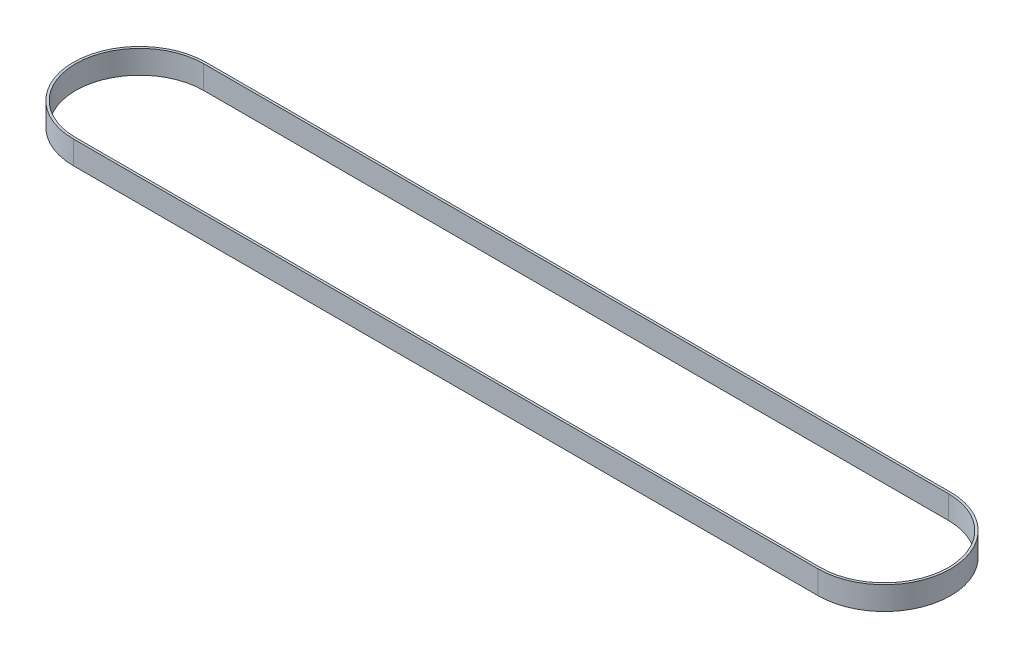
ISO-10303-21;
HEADER;
FILE_DESCRIPTION(('STEP AP214'),'2;1');
FILE_NAME('part.step','',(''),(''),'','','');
FILE_SCHEMA(('AUTOMOTIVE_DESIGN { 1 0 10303 214 1 1 1 1 }'));
ENDSEC;
DATA;
#1=APPLICATION_CONTEXT('core data for automotive mechanical design processes');
#2=APPLICATION_PROTOCOL_DEFINITION('international standard','automotive_design',2000,#1);
#3=PRODUCT_CONTEXT('',#1,'mechanical');
#4=PRODUCT('Part','Part','',(#3));
#5=PRODUCT_RELATED_PRODUCT_CATEGORY('part','',(#4));
#6=PRODUCT_DEFINITION_FORMATION('','',#4);
#7=PRODUCT_DEFINITION_CONTEXT('part definition',#1,'design');
#8=PRODUCT_DEFINITION('design','',#6,#7);
#9=PRODUCT_DEFINITION_SHAPE('','',#8);
#10=(LENGTH_UNIT() NAMED_UNIT(*) SI_UNIT(.MILLI.,.METRE.));
#11=(NAMED_UNIT(*) PLANE_ANGLE_UNIT() SI_UNIT($,.RADIAN.));
#12=(NAMED_UNIT(*) SI_UNIT($,.STERADIAN.) SOLID_ANGLE_UNIT());
#13=UNCERTAINTY_MEASURE_WITH_UNIT(LENGTH_MEASURE(1.E-05),#10,'distance_accuracy_value','');
#14=(GEOMETRIC_REPRESENTATION_CONTEXT(3) GLOBAL_UNCERTAINTY_ASSIGNED_CONTEXT((#13)) GLOBAL_UNIT_ASSIGNED_CONTEXT((#10,
#11,#12)) REPRESENTATION_CONTEXT('',''));
#15=CARTESIAN_POINT('',(0.,0.,0.));
#16=DIRECTION('',(0.,0.,1.));
#17=DIRECTION('',(1.,0.,0.));
#18=AXIS2_PLACEMENT_3D('',#15,#16,#17);
#19=CARTESIAN_POINT('',(0.,10.,0.));
#20=DIRECTION('',(0.,1.,0.));
#21=DIRECTION('',(0.,0.,1.));
#22=AXIS2_PLACEMENT_3D('',#19,#20,#21);
#23=PLANE('',#22);
#24=CARTESIAN_POINT('',(0.,10.,0.));
#25=DIRECTION('',(0.,1.,0.));
#26=DIRECTION('',(0.,0.,1.));
#27=AXIS2_PLACEMENT_3D('',#24,#25,#26);
#28=CIRCLE('',#27,28.5);
#29=CARTESIAN_POINT('',(0.,10.,-28.5));
#30=VERTEX_POINT('',#29);
#31=CARTESIAN_POINT('',(0.,10.,28.5));
#32=VERTEX_POINT('',#31);
#33=EDGE_CURVE('E153',#30,#32,#28,.T.);
#34=ORIENTED_EDGE('',*,*,#33,.T.);
#35=DIRECTION('',(1.,0.,0.));
#36=VECTOR('',#35,1.);
#37=CARTESIAN_POINT('',(0.,10.,28.5));
#38=LINE('',#37,#36);
#39=CARTESIAN_POINT('',(320.,10.,28.5));
#40=VERTEX_POINT('',#39);
#41=EDGE_CURVE('E157',#32,#40,#38,.T.);
#42=ORIENTED_EDGE('',*,*,#41,.T.);
#43=CARTESIAN_POINT('',(320.,10.,0.));
#44=DIRECTION('',(0.,1.,0.));
#45=DIRECTION('',(0.,0.,1.));
#46=AXIS2_PLACEMENT_3D('',#43,#44,#45);
#47=CIRCLE('',#46,28.5);
#48=CARTESIAN_POINT('',(320.,10.,-28.5));
#49=VERTEX_POINT('',#48);
#50=EDGE_CURVE('E161',#40,#49,#47,.T.);
#51=ORIENTED_EDGE('',*,*,#50,.T.);
#52=DIRECTION('',(-1.,0.,0.));
#53=VECTOR('',#52,1.);
#54=CARTESIAN_POINT('',(0.,10.,-28.5));
#55=LINE('',#54,#53);
#56=EDGE_CURVE('E164',#49,#30,#55,.T.);
#57=ORIENTED_EDGE('',*,*,#56,.T.);
#58=EDGE_LOOP('',(#34,#42,#51,#57));
#59=FACE_BOUND('',#58,.T.);
#60=DIRECTION('',(1.,0.,0.));
#61=VECTOR('',#60,1.);
#62=CARTESIAN_POINT('',(0.,10.,27.5));
#63=LINE('',#62,#61);
#64=CARTESIAN_POINT('',(0.,10.,27.5));
#65=VERTEX_POINT('',#64);
#66=CARTESIAN_POINT('',(320.,10.,27.5));
#67=VERTEX_POINT('',#66);
#68=EDGE_CURVE('E114',#65,#67,#63,.T.);
#69=ORIENTED_EDGE('',*,*,#68,.F.);
#70=CARTESIAN_POINT('',(0.,10.,0.));
#71=DIRECTION('',(0.,1.,0.));
#72=DIRECTION('',(0.,0.,1.));
#73=AXIS2_PLACEMENT_3D('',#70,#71,#72);
#74=CIRCLE('',#73,27.5);
#75=CARTESIAN_POINT('',(0.,10.,-27.5));
#76=VERTEX_POINT('',#75);
#77=EDGE_CURVE('E105',#76,#65,#74,.T.);
#78=ORIENTED_EDGE('',*,*,#77,.F.);
#79=DIRECTION('',(-1.,0.,0.));
#80=VECTOR('',#79,1.);
#81=CARTESIAN_POINT('',(0.,10.,-27.5));
#82=LINE('',#81,#80);
#83=CARTESIAN_POINT('',(320.,10.,-27.5));
#84=VERTEX_POINT('',#83);
#85=EDGE_CURVE('E131',#84,#76,#82,.T.);
#86=ORIENTED_EDGE('',*,*,#85,.F.);
#87=CARTESIAN_POINT('',(320.,10.,0.));
#88=DIRECTION('',(0.,1.,0.));
#89=DIRECTION('',(0.,0.,1.));
#90=AXIS2_PLACEMENT_3D('',#87,#88,#89);
#91=CIRCLE('',#90,27.5);
#92=EDGE_CURVE('E127',#67,#84,#91,.T.);
#93=ORIENTED_EDGE('',*,*,#92,.F.);
#94=EDGE_LOOP('',(#69,#78,#86,#93));
#95=FACE_BOUND('',#94,.T.);
#96=ADVANCED_FACE('F39',(#59,#95),#23,.T.);
#97=CARTESIAN_POINT('',(0.,0.,0.));
#98=DIRECTION('',(0.,1.,0.));
#99=DIRECTION('',(0.,0.,1.));
#100=AXIS2_PLACEMENT_3D('',#97,#98,#99);
#101=PLANE('',#100);
#102=CARTESIAN_POINT('',(0.,0.,0.));
#103=DIRECTION('',(0.,1.,0.));
#104=DIRECTION('',(0.,0.,1.));
#105=AXIS2_PLACEMENT_3D('',#102,#103,#104);
#106=CIRCLE('',#105,28.5);
#107=CARTESIAN_POINT('',(0.,0.,-28.5));
#108=VERTEX_POINT('',#107);
#109=CARTESIAN_POINT('',(0.,0.,28.5));
#110=VERTEX_POINT('',#109);
#111=EDGE_CURVE('E123',#108,#110,#106,.T.);
#112=ORIENTED_EDGE('',*,*,#111,.F.);
#113=DIRECTION('',(-1.,0.,0.));
#114=VECTOR('',#113,1.);
#115=CARTESIAN_POINT('',(0.,0.,-28.5));
#116=LINE('',#115,#114);
#117=CARTESIAN_POINT('',(320.,0.,-28.5));
#118=VERTEX_POINT('',#117);
#119=EDGE_CURVE('E158',#118,#108,#116,.T.);
#120=ORIENTED_EDGE('',*,*,#119,.F.);
#121=CARTESIAN_POINT('',(320.,0.,0.));
#122=DIRECTION('',(0.,1.,0.));
#123=DIRECTION('',(0.,0.,1.));
#124=AXIS2_PLACEMENT_3D('',#121,#122,#123);
#125=CIRCLE('',#124,28.5);
#126=CARTESIAN_POINT('',(320.,0.,28.5));
#127=VERTEX_POINT('',#126);
#128=EDGE_CURVE('E174',#127,#118,#125,.T.);
#129=ORIENTED_EDGE('',*,*,#128,.F.);
#130=DIRECTION('',(1.,0.,0.));
#131=VECTOR('',#130,1.);
#132=CARTESIAN_POINT('',(0.,0.,28.5));
#133=LINE('',#132,#131);
#134=EDGE_CURVE('E171',#110,#127,#133,.T.);
#135=ORIENTED_EDGE('',*,*,#134,.F.);
#136=EDGE_LOOP('',(#112,#120,#129,#135));
#137=FACE_BOUND('',#136,.T.);
#138=CARTESIAN_POINT('',(0.,0.,0.));
#139=DIRECTION('',(0.,1.,0.));
#140=DIRECTION('',(0.,0.,1.));
#141=AXIS2_PLACEMENT_3D('',#138,#139,#140);
#142=CIRCLE('',#141,27.5);
#143=CARTESIAN_POINT('',(0.,0.,-27.5));
#144=VERTEX_POINT('',#143);
#145=CARTESIAN_POINT('',(0.,0.,27.5));
#146=VERTEX_POINT('',#145);
#147=EDGE_CURVE('E63',#144,#146,#142,.T.);
#148=ORIENTED_EDGE('',*,*,#147,.T.);
#149=DIRECTION('',(1.,0.,0.));
#150=VECTOR('',#149,1.);
#151=CARTESIAN_POINT('',(0.,0.,27.5));
#152=LINE('',#151,#150);
#153=CARTESIAN_POINT('',(320.,0.,27.5));
#154=VERTEX_POINT('',#153);
#155=EDGE_CURVE('E121',#146,#154,#152,.T.);
#156=ORIENTED_EDGE('',*,*,#155,.T.);
#157=CARTESIAN_POINT('',(320.,0.,0.));
#158=DIRECTION('',(0.,1.,0.));
#159=DIRECTION('',(0.,0.,1.));
#160=AXIS2_PLACEMENT_3D('',#157,#158,#159);
#161=CIRCLE('',#160,27.5);
#162=CARTESIAN_POINT('',(320.,0.,-27.5));
#163=VERTEX_POINT('',#162);
#164=EDGE_CURVE('E140',#154,#163,#161,.T.);
#165=ORIENTED_EDGE('',*,*,#164,.T.);
#166=DIRECTION('',(-1.,0.,0.));
#167=VECTOR('',#166,1.);
#168=CARTESIAN_POINT('',(0.,0.,-27.5));
#169=LINE('',#168,#167);
#170=EDGE_CURVE('E115',#163,#144,#169,.T.);
#171=ORIENTED_EDGE('',*,*,#170,.T.);
#172=EDGE_LOOP('',(#148,#156,#165,#171));
#173=FACE_BOUND('',#172,.T.);
#174=ADVANCED_FACE('F197',(#137,#173),#101,.F.);
#175=CARTESIAN_POINT('',(0.,10.,0.));
#176=DIRECTION('',(0.,-1.,0.));
#177=DIRECTION('',(0.,0.,-1.));
#178=AXIS2_PLACEMENT_3D('',#175,#176,#177);
#179=CYLINDRICAL_SURFACE('',#178,28.5);
#180=ORIENTED_EDGE('',*,*,#111,.T.);
#181=DIRECTION('',(0.,-1.,0.));
#182=VECTOR('',#181,1.);
#183=CARTESIAN_POINT('',(0.,10.,28.5));
#184=LINE('',#183,#182);
#185=EDGE_CURVE('E11',#32,#110,#184,.T.);
#186=ORIENTED_EDGE('',*,*,#185,.F.);
#187=ORIENTED_EDGE('',*,*,#33,.F.);
#188=DIRECTION('',(0.,-1.,0.));
#189=VECTOR('',#188,1.);
#190=CARTESIAN_POINT('',(0.,10.,-28.5));
#191=LINE('',#190,#189);
#192=EDGE_CURVE('E167',#30,#108,#191,.T.);
#193=ORIENTED_EDGE('',*,*,#192,.T.);
#194=EDGE_LOOP('',(#180,#186,#187,#193));
#195=FACE_BOUND('',#194,.T.);
#196=ADVANCED_FACE('F41',(#195),#179,.T.);
#197=CARTESIAN_POINT('',(0.,10.,28.5));
#198=DIRECTION('',(0.,0.,-1.));
#199=DIRECTION('',(-1.,0.,0.));
#200=AXIS2_PLACEMENT_3D('',#197,#198,#199);
#201=PLANE('',#200);
#202=ORIENTED_EDGE('',*,*,#134,.T.);
#203=DIRECTION('',(0.,-1.,0.));
#204=VECTOR('',#203,1.);
#205=CARTESIAN_POINT('',(320.,10.,28.5));
#206=LINE('',#205,#204);
#207=EDGE_CURVE('E48',#40,#127,#206,.T.);
#208=ORIENTED_EDGE('',*,*,#207,.F.);
#209=ORIENTED_EDGE('',*,*,#41,.F.);
#210=ORIENTED_EDGE('',*,*,#185,.T.);
#211=EDGE_LOOP('',(#202,#208,#209,#210));
#212=FACE_BOUND('',#211,.T.);
#213=ADVANCED_FACE('F207',(#212),#201,.F.);
#214=CARTESIAN_POINT('',(320.,10.,0.));
#215=DIRECTION('',(0.,-1.,0.));
#216=DIRECTION('',(0.,0.,-1.));
#217=AXIS2_PLACEMENT_3D('',#214,#215,#216);
#218=CYLINDRICAL_SURFACE('',#217,28.5);
#219=ORIENTED_EDGE('',*,*,#128,.T.);
#220=DIRECTION('',(0.,-1.,0.));
#221=VECTOR('',#220,1.);
#222=CARTESIAN_POINT('',(320.,10.,-28.5));
#223=LINE('',#222,#221);
#224=EDGE_CURVE('E182',#49,#118,#223,.T.);
#225=ORIENTED_EDGE('',*,*,#224,.F.);
#226=ORIENTED_EDGE('',*,*,#50,.F.);
#227=ORIENTED_EDGE('',*,*,#207,.T.);
#228=EDGE_LOOP('',(#219,#225,#226,#227));
#229=FACE_BOUND('',#228,.T.);
#230=ADVANCED_FACE('F191',(#229),#218,.T.);
#231=CARTESIAN_POINT('',(0.,10.,-28.5));
#232=DIRECTION('',(0.,0.,1.));
#233=DIRECTION('',(1.,0.,0.));
#234=AXIS2_PLACEMENT_3D('',#231,#232,#233);
#235=PLANE('',#234);
#236=ORIENTED_EDGE('',*,*,#119,.T.);
#237=ORIENTED_EDGE('',*,*,#192,.F.);
#238=ORIENTED_EDGE('',*,*,#56,.F.);
#239=ORIENTED_EDGE('',*,*,#224,.T.);
#240=EDGE_LOOP('',(#236,#237,#238,#239));
#241=FACE_BOUND('',#240,.T.);
#242=ADVANCED_FACE('F201',(#241),#235,.F.);
#243=CARTESIAN_POINT('',(0.,10.,0.));
#244=DIRECTION('',(0.,-1.,0.));
#245=DIRECTION('',(0.,0.,-1.));
#246=AXIS2_PLACEMENT_3D('',#243,#244,#245);
#247=CYLINDRICAL_SURFACE('',#246,27.5);
#248=ORIENTED_EDGE('',*,*,#147,.F.);
#249=DIRECTION('',(0.,-1.,0.));
#250=VECTOR('',#249,1.);
#251=CARTESIAN_POINT('',(0.,10.,-27.5));
#252=LINE('',#251,#250);
#253=EDGE_CURVE('E109',#76,#144,#252,.T.);
#254=ORIENTED_EDGE('',*,*,#253,.F.);
#255=ORIENTED_EDGE('',*,*,#77,.T.);
#256=DIRECTION('',(0.,-1.,0.));
#257=VECTOR('',#256,1.);
#258=CARTESIAN_POINT('',(0.,10.,27.5));
#259=LINE('',#258,#257);
#260=EDGE_CURVE('E108',#65,#146,#259,.T.);
#261=ORIENTED_EDGE('',*,*,#260,.T.);
#262=EDGE_LOOP('',(#248,#254,#255,#261));
#263=FACE_BOUND('',#262,.T.);
#264=ADVANCED_FACE('F107',(#263),#247,.F.);
#265=CARTESIAN_POINT('',(0.,10.,27.5));
#266=DIRECTION('',(0.,0.,-1.));
#267=DIRECTION('',(-1.,0.,0.));
#268=AXIS2_PLACEMENT_3D('',#265,#266,#267);
#269=PLANE('',#268);
#270=ORIENTED_EDGE('',*,*,#155,.F.);
#271=ORIENTED_EDGE('',*,*,#260,.F.);
#272=ORIENTED_EDGE('',*,*,#68,.T.);
#273=DIRECTION('',(0.,-1.,0.));
#274=VECTOR('',#273,1.);
#275=CARTESIAN_POINT('',(320.,10.,27.5));
#276=LINE('',#275,#274);
#277=EDGE_CURVE('E124',#67,#154,#276,.T.);
#278=ORIENTED_EDGE('',*,*,#277,.T.);
#279=EDGE_LOOP('',(#270,#271,#272,#278));
#280=FACE_BOUND('',#279,.T.);
#281=ADVANCED_FACE('F118',(#280),#269,.T.);
#282=CARTESIAN_POINT('',(320.,10.,0.));
#283=DIRECTION('',(0.,-1.,0.));
#284=DIRECTION('',(0.,0.,-1.));
#285=AXIS2_PLACEMENT_3D('',#282,#283,#284);
#286=CYLINDRICAL_SURFACE('',#285,27.5);
#287=ORIENTED_EDGE('',*,*,#164,.F.);
#288=ORIENTED_EDGE('',*,*,#277,.F.);
#289=ORIENTED_EDGE('',*,*,#92,.T.);
#290=DIRECTION('',(0.,-1.,0.));
#291=VECTOR('',#290,1.);
#292=CARTESIAN_POINT('',(320.,10.,-27.5));
#293=LINE('',#292,#291);
#294=EDGE_CURVE('E55',#84,#163,#293,.T.);
#295=ORIENTED_EDGE('',*,*,#294,.T.);
#296=EDGE_LOOP('',(#287,#288,#289,#295));
#297=FACE_BOUND('',#296,.T.);
#298=ADVANCED_FACE('F230',(#297),#286,.F.);
#299=CARTESIAN_POINT('',(0.,10.,-27.5));
#300=DIRECTION('',(0.,0.,1.));
#301=DIRECTION('',(1.,0.,0.));
#302=AXIS2_PLACEMENT_3D('',#299,#300,#301);
#303=PLANE('',#302);
#304=ORIENTED_EDGE('',*,*,#170,.F.);
#305=ORIENTED_EDGE('',*,*,#294,.F.);
#306=ORIENTED_EDGE('',*,*,#85,.T.);
#307=ORIENTED_EDGE('',*,*,#253,.T.);
#308=EDGE_LOOP('',(#304,#305,#306,#307));
#309=FACE_BOUND('',#308,.T.);
#310=ADVANCED_FACE('F234',(#309),#303,.T.);
#311=CLOSED_SHELL('',(#96,#174,#196,#213,#230,#242,#264,#281,#298,#310));
#312=MANIFOLD_SOLID_BREP('B2',#311);
#313=ADVANCED_BREP_SHAPE_REPRESENTATION('',(#18,#312),#14);
#314=SHAPE_DEFINITION_REPRESENTATION(#9,#313);
ENDSEC;
END-ISO-10303-21;
